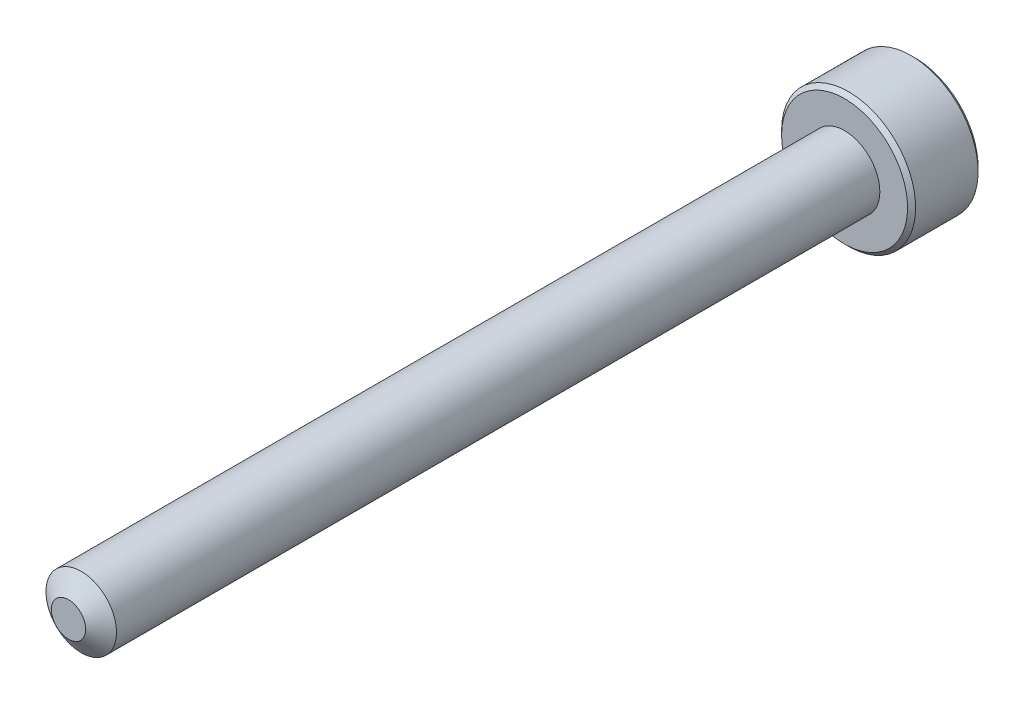
ISO-10303-21;
HEADER;
FILE_DESCRIPTION(('STEP AP214'),'2;1');
FILE_NAME('part.step','',(''),(''),'','','');
FILE_SCHEMA(('AUTOMOTIVE_DESIGN { 1 0 10303 214 1 1 1 1 }'));
ENDSEC;
DATA;
#1=APPLICATION_CONTEXT('core data for automotive mechanical design processes');
#2=APPLICATION_PROTOCOL_DEFINITION('international standard','automotive_design',2000,#1);
#3=PRODUCT_CONTEXT('',#1,'mechanical');
#4=PRODUCT('Part','Part','',(#3));
#5=PRODUCT_RELATED_PRODUCT_CATEGORY('part','',(#4));
#6=PRODUCT_DEFINITION_FORMATION('','',#4);
#7=PRODUCT_DEFINITION_CONTEXT('part definition',#1,'design');
#8=PRODUCT_DEFINITION('design','',#6,#7);
#9=PRODUCT_DEFINITION_SHAPE('','',#8);
#10=(LENGTH_UNIT() NAMED_UNIT(*) SI_UNIT(.MILLI.,.METRE.));
#11=(NAMED_UNIT(*) PLANE_ANGLE_UNIT() SI_UNIT($,.RADIAN.));
#12=(NAMED_UNIT(*) SI_UNIT($,.STERADIAN.) SOLID_ANGLE_UNIT());
#13=UNCERTAINTY_MEASURE_WITH_UNIT(LENGTH_MEASURE(1.E-05),#10,'distance_accuracy_value','');
#14=(GEOMETRIC_REPRESENTATION_CONTEXT(3) GLOBAL_UNCERTAINTY_ASSIGNED_CONTEXT((#13)) GLOBAL_UNIT_ASSIGNED_CONTEXT((#10,
#11,#12)) REPRESENTATION_CONTEXT('',''));
#15=CARTESIAN_POINT('',(0.,0.,0.));
#16=DIRECTION('',(0.,0.,1.));
#17=DIRECTION('',(1.,0.,0.));
#18=AXIS2_PLACEMENT_3D('',#15,#16,#17);
#19=CARTESIAN_POINT('',(0.,0.,-22.));
#20=DIRECTION('',(0.,0.,1.));
#21=DIRECTION('',(1.,0.,0.));
#22=AXIS2_PLACEMENT_3D('',#19,#20,#21);
#23=CYLINDRICAL_SURFACE('',#22,1.);
#24=CARTESIAN_POINT('',(0.,0.,-0.359771969508557));
#25=DIRECTION('',(0.,0.,1.));
#26=DIRECTION('',(1.,0.,0.));
#27=AXIS2_PLACEMENT_3D('',#24,#25,#26);
#28=CIRCLE('',#27,1.);
#29=CARTESIAN_POINT('',(1.,0.,-0.359771969508557));
#30=VERTEX_POINT('',#29);
#31=EDGE_CURVE('E109',#30,#30,#28,.T.);
#32=ORIENTED_EDGE('',*,*,#31,.F.);
#33=EDGE_LOOP('',(#32));
#34=FACE_BOUND('',#33,.T.);
#35=CARTESIAN_POINT('',(0.,0.,-22.));
#36=DIRECTION('',(0.,0.,-1.));
#37=DIRECTION('',(-1.,0.,0.));
#38=AXIS2_PLACEMENT_3D('',#35,#36,#37);
#39=CIRCLE('',#38,1.);
#40=CARTESIAN_POINT('',(-1.,0.,-22.));
#41=VERTEX_POINT('',#40);
#42=EDGE_CURVE('E212',#41,#41,#39,.F.);
#43=ORIENTED_EDGE('',*,*,#42,.T.);
#44=EDGE_LOOP('',(#43));
#45=FACE_BOUND('',#44,.T.);
#46=ADVANCED_FACE('F35',(#34,#45),#23,.T.);
#47=CARTESIAN_POINT('',(0.,0.,0.));
#48=DIRECTION('',(0.,0.,-1.));
#49=DIRECTION('',(-1.,0.,0.));
#50=AXIS2_PLACEMENT_3D('',#47,#48,#49);
#51=CONICAL_SURFACE('',#50,0.486192378864667,0.959931088596884);
#52=ORIENTED_EDGE('',*,*,#31,.T.);
#53=EDGE_LOOP('',(#52));
#54=FACE_BOUND('',#53,.T.);
#55=CARTESIAN_POINT('',(0.,0.,0.));
#56=DIRECTION('',(0.,0.,1.));
#57=DIRECTION('',(1.,0.,0.));
#58=AXIS2_PLACEMENT_3D('',#55,#56,#57);
#59=CIRCLE('',#58,0.486192378864667);
#60=CARTESIAN_POINT('',(0.486192378864667,0.,0.));
#61=VERTEX_POINT('',#60);
#62=EDGE_CURVE('E210',#61,#61,#59,.T.);
#63=ORIENTED_EDGE('',*,*,#62,.F.);
#64=EDGE_LOOP('',(#63));
#65=FACE_BOUND('',#64,.T.);
#66=ADVANCED_FACE('F193',(#54,#65),#51,.T.);
#67=CARTESIAN_POINT('',(0.,0.,0.));
#68=DIRECTION('',(0.,0.,1.));
#69=DIRECTION('',(1.,0.,0.));
#70=AXIS2_PLACEMENT_3D('',#67,#68,#69);
#71=PLANE('',#70);
#72=ORIENTED_EDGE('',*,*,#62,.T.);
#73=EDGE_LOOP('',(#72));
#74=FACE_BOUND('',#73,.T.);
#75=ADVANCED_FACE('F190',(#74),#71,.T.);
#76=CARTESIAN_POINT('',(0.,0.,-24.));
#77=DIRECTION('',(0.,0.,1.));
#78=DIRECTION('',(1.,0.,0.));
#79=AXIS2_PLACEMENT_3D('',#76,#77,#78);
#80=CYLINDRICAL_SURFACE('',#79,1.9);
#81=CARTESIAN_POINT('',(0.,0.,-23.886));
#82=DIRECTION('',(0.,0.,-1.));
#83=DIRECTION('',(-1.,0.,0.));
#84=AXIS2_PLACEMENT_3D('',#81,#82,#83);
#85=CIRCLE('',#84,1.9);
#86=CARTESIAN_POINT('',(-1.9,0.,-23.886));
#87=VERTEX_POINT('',#86);
#88=EDGE_CURVE('E43',#87,#87,#85,.F.);
#89=ORIENTED_EDGE('',*,*,#88,.T.);
#90=EDGE_LOOP('',(#89));
#91=FACE_BOUND('',#90,.T.);
#92=CARTESIAN_POINT('',(0.,0.,-22.114));
#93=DIRECTION('',(0.,0.,-1.));
#94=DIRECTION('',(-1.,0.,0.));
#95=AXIS2_PLACEMENT_3D('',#92,#93,#94);
#96=CIRCLE('',#95,1.9);
#97=CARTESIAN_POINT('',(-1.9,0.,-22.114));
#98=VERTEX_POINT('',#97);
#99=EDGE_CURVE('E169',#98,#98,#96,.T.);
#100=ORIENTED_EDGE('',*,*,#99,.T.);
#101=EDGE_LOOP('',(#100));
#102=FACE_BOUND('',#101,.T.);
#103=ADVANCED_FACE('F174',(#91,#102),#80,.T.);
#104=CARTESIAN_POINT('',(0.,0.,-24.));
#105=DIRECTION('',(0.,0.,-1.));
#106=DIRECTION('',(-1.,0.,0.));
#107=AXIS2_PLACEMENT_3D('',#104,#105,#106);
#108=PLANE('',#107);
#109=CARTESIAN_POINT('',(0.,0.,-24.));
#110=DIRECTION('',(0.,0.,-1.));
#111=DIRECTION('',(-1.,0.,0.));
#112=AXIS2_PLACEMENT_3D('',#109,#110,#111);
#113=CIRCLE('',#112,1.786);
#114=CARTESIAN_POINT('',(-1.786,0.,-24.));
#115=VERTEX_POINT('',#114);
#116=EDGE_CURVE('E108',#115,#115,#113,.T.);
#117=ORIENTED_EDGE('',*,*,#116,.T.);
#118=EDGE_LOOP('',(#117));
#119=FACE_BOUND('',#118,.T.);
#120=CARTESIAN_POINT('',(0.,0.,-24.));
#121=DIRECTION('',(0.,0.,-1.));
#122=DIRECTION('',(-1.,0.,0.));
#123=AXIS2_PLACEMENT_3D('',#120,#121,#122);
#124=CIRCLE('',#123,0.866025403784439);
#125=CARTESIAN_POINT('',(-0.75,0.433012701892219,-24.));
#126=VERTEX_POINT('',#125);
#127=CARTESIAN_POINT('',(0.,0.866025403784439,-24.));
#128=VERTEX_POINT('',#127);
#129=EDGE_CURVE('E89',#126,#128,#124,.T.);
#130=ORIENTED_EDGE('',*,*,#129,.F.);
#131=CARTESIAN_POINT('',(-0.75,-0.433012701892219,-24.));
#132=VERTEX_POINT('',#131);
#133=EDGE_CURVE('E49',#132,#126,#124,.T.);
#134=ORIENTED_EDGE('',*,*,#133,.F.);
#135=CARTESIAN_POINT('',(0.,-0.866025403784439,-24.));
#136=VERTEX_POINT('',#135);
#137=EDGE_CURVE('E269',#136,#132,#124,.T.);
#138=ORIENTED_EDGE('',*,*,#137,.F.);
#139=CARTESIAN_POINT('',(0.75,-0.433012701892219,-24.));
#140=VERTEX_POINT('',#139);
#141=EDGE_CURVE('E56',#140,#136,#124,.T.);
#142=ORIENTED_EDGE('',*,*,#141,.F.);
#143=CARTESIAN_POINT('',(0.75,0.43301270189222,-24.));
#144=VERTEX_POINT('',#143);
#145=EDGE_CURVE('E130',#144,#140,#124,.T.);
#146=ORIENTED_EDGE('',*,*,#145,.F.);
#147=EDGE_CURVE('E98',#128,#144,#124,.T.);
#148=ORIENTED_EDGE('',*,*,#147,.F.);
#149=EDGE_LOOP('',(#130,#134,#138,#142,#146,#148));
#150=FACE_BOUND('',#149,.T.);
#151=ADVANCED_FACE('F129',(#119,#150),#108,.T.);
#152=CARTESIAN_POINT('',(0.,0.,-22.));
#153=DIRECTION('',(0.,0.,-1.));
#154=DIRECTION('',(-1.,0.,0.));
#155=AXIS2_PLACEMENT_3D('',#152,#153,#154);
#156=PLANE('',#155);
#157=CARTESIAN_POINT('',(0.,0.,-22.));
#158=DIRECTION('',(0.,0.,-1.));
#159=DIRECTION('',(-1.,0.,0.));
#160=AXIS2_PLACEMENT_3D('',#157,#158,#159);
#161=CIRCLE('',#160,1.786);
#162=CARTESIAN_POINT('',(-1.786,0.,-22.));
#163=VERTEX_POINT('',#162);
#164=EDGE_CURVE('E11',#163,#163,#161,.F.);
#165=ORIENTED_EDGE('',*,*,#164,.T.);
#166=EDGE_LOOP('',(#165));
#167=FACE_BOUND('',#166,.T.);
#168=ORIENTED_EDGE('',*,*,#42,.F.);
#169=EDGE_LOOP('',(#168));
#170=FACE_BOUND('',#169,.T.);
#171=ADVANCED_FACE('F183',(#167,#170),#156,.F.);
#172=CARTESIAN_POINT('',(0.,0.,-24.));
#173=DIRECTION('',(0.,0.,-1.));
#174=DIRECTION('',(-1.,0.,0.));
#175=AXIS2_PLACEMENT_3D('',#172,#173,#174);
#176=CONICAL_SURFACE('',#175,0.866025403784439,0.78539816339745);
#177=ORIENTED_EDGE('',*,*,#147,.T.);
#178=CARTESIAN_POINT('',(-0.000200000000000044,0.866140873838277,-24.0001154931448));
#179=CARTESIAN_POINT('',(0.0255899625576817,0.851251032013209,-23.9852341104639));
#180=CARTESIAN_POINT('',(0.0518112021286595,0.836112192288419,-23.971226265607));
#181=CARTESIAN_POINT('',(0.105279708235706,0.805242135894348,-23.9455775246823));
#182=CARTESIAN_POINT('',(0.132532067460572,0.78950797895982,-23.9339509117057));
#183=CARTESIAN_POINT('',(0.187485350381352,0.757780686272653,-23.9140340457722));
#184=CARTESIAN_POINT('',(0.215172256695509,0.741795643459147,-23.9056936940814));
#185=CARTESIAN_POINT('',(0.271155595130853,0.709473647943368,-23.8928427419614));
#186=CARTESIAN_POINT('',(0.299450314843645,0.693137683900542,-23.8883225405888));
#187=CARTESIAN_POINT('',(0.348210289268843,0.664986099540475,-23.8842458330974));
#188=CARTESIAN_POINT('',(0.368612065655572,0.65320712845165,-23.8836427966141));
#189=CARTESIAN_POINT('',(0.40937613469636,0.629671982217687,-23.8846545060155));
#190=CARTESIAN_POINT('',(0.429738417651455,0.617915812672248,-23.88626974099));
#191=CARTESIAN_POINT('',(0.490534543086823,0.582815153286451,-23.894336146973));
#192=CARTESIAN_POINT('',(0.530665854996099,0.559645329552698,-23.9040089358277));
#193=CARTESIAN_POINT('',(0.601110400354026,0.518974152327358,-23.9273563179723));
#194=CARTESIAN_POINT('',(0.631753572009087,0.501282308923485,-23.9398085580723));
#195=CARTESIAN_POINT('',(0.69183934580479,0.466591771248069,-23.9678596102309));
#196=CARTESIAN_POINT('',(0.721285488381591,0.449591032904757,-23.9834481859038));
#197=CARTESIAN_POINT('',(0.7502,0.432897231838381,-24.0001154931448));
#198=B_SPLINE_CURVE_WITH_KNOTS('',3,(#178,#179,#180,#181,#182,#183,#184,#185,#186,#187,#188,
#189,#190,#191,#192,#193,#194,#195,#196,#197),.UNSPECIFIED.,.F.,.F.,(4,2,2,2,2,2,2,2,2,4),(0.,
0.0999419466095604,0.200466857654446,0.299393763705717,0.39807129730023,0.468665775681747,
0.539275821398839,0.680536257244566,0.792918418368075,0.904939568716032),.UNSPECIFIED.);
#199=EDGE_CURVE('E103',#128,#144,#198,.T.);
#200=ORIENTED_EDGE('',*,*,#199,.F.);
#201=EDGE_LOOP('',(#177,#200));
#202=FACE_BOUND('',#201,.T.);
#203=ADVANCED_FACE('F104',(#202),#176,.F.);
#204=ORIENTED_EDGE('',*,*,#145,.T.);
#205=CARTESIAN_POINT('',(0.75,-0.863604064848461,-24.2777892581354));
#206=CARTESIAN_POINT('',(0.75,-0.842575879734332,-24.2619149320084));
#207=CARTESIAN_POINT('',(0.75,-0.821430496291559,-24.246196265183));
#208=CARTESIAN_POINT('',(0.75,-0.778857857419019,-24.2151345206266));
#209=CARTESIAN_POINT('',(0.75,-0.757430533042236,-24.1997915374936));
#210=CARTESIAN_POINT('',(0.75,-0.692340710712936,-24.1542035802937));
#211=CARTESIAN_POINT('',(0.75,-0.648190081053413,-24.1246440917434));
#212=CARTESIAN_POINT('',(0.75,-0.55560718150175,-24.0666155826928));
#213=CARTESIAN_POINT('',(0.75,-0.507074363017996,-24.0383051093658));
#214=CARTESIAN_POINT('',(0.75,-0.407587529772338,-23.9865181117689));
#215=CARTESIAN_POINT('',(0.75,-0.356642419548471,-23.9630252915319));
#216=CARTESIAN_POINT('',(0.75,-0.280165468820771,-23.9342868995007));
#217=CARTESIAN_POINT('',(0.75,-0.255770023930572,-23.9260392748131));
#218=CARTESIAN_POINT('',(0.75,-0.206403277885132,-23.9114971754202));
#219=CARTESIAN_POINT('',(0.75,-0.181431937185907,-23.9052028352691));
#220=CARTESIAN_POINT('',(0.75,-0.106699879404924,-23.8899931738806));
#221=CARTESIAN_POINT('',(0.75,-0.0561907171762169,-23.8843771847129));
#222=CARTESIAN_POINT('',(0.75,0.0430767231749068,-23.8836282564544));
#223=CARTESIAN_POINT('',(0.75,0.0918322434166292,-23.8881234514056));
#224=CARTESIAN_POINT('',(0.75,0.164112195698296,-23.901337307446));
#225=CARTESIAN_POINT('',(0.75,0.188278676879438,-23.9069014463821));
#226=CARTESIAN_POINT('',(0.75,0.236094480120332,-23.9199231661487));
#227=CARTESIAN_POINT('',(0.75,0.259743845273042,-23.9273805885477));
#228=CARTESIAN_POINT('',(0.75,0.33419827846382,-23.9536664694661));
#229=CARTESIAN_POINT('',(0.75,0.383940060445496,-23.9754903380484));
#230=CARTESIAN_POINT('',(0.75,0.481089225076667,-24.0240118041006));
#231=CARTESIAN_POINT('',(0.75,0.528487417973018,-24.0507269113104));
#232=CARTESIAN_POINT('',(0.75,0.619071540465252,-24.1058428511508));
#233=CARTESIAN_POINT('',(0.75,0.662349745300239,-24.1340939454522));
#234=CARTESIAN_POINT('',(0.75,0.726111623216224,-24.1777671470975));
#235=CARTESIAN_POINT('',(0.75,0.747090419255278,-24.1924788605167));
#236=CARTESIAN_POINT('',(0.75,0.788761341501858,-24.2222913841024));
#237=CARTESIAN_POINT('',(0.75,0.809453544535618,-24.237392086763));
#238=CARTESIAN_POINT('',(0.75,0.830026390097468,-24.2526540893047));
#239=B_SPLINE_CURVE_WITH_KNOTS('',3,(#205,#206,#207,#208,#209,#210,#211,#212,#213,#214,#215,
#216,#217,#218,#219,#220,#221,#222,#223,#224,#225,#226,#227,#228,#229,#230,#231,#232,#233,#234,
#235,#236,#237,#238),.UNSPECIFIED.,.F.,.F.,(4,2,2,2,2,2,2,2,2,2,2,2,2,2,2,2,4),(0.,
0.0790398443124688,0.158099390497591,0.3174252086741,0.485845155681374,0.653685658303954,
0.730869805636062,0.808059268704007,0.959469653380778,1.10540290447489,1.17973203111653,
1.25405493988072,1.41653726506053,1.57961304287543,1.73458511695816,1.81145152932466,
1.8882969211581),.UNSPECIFIED.);
#240=EDGE_CURVE('E97',#144,#140,#239,.F.);
#241=ORIENTED_EDGE('',*,*,#240,.F.);
#242=EDGE_LOOP('',(#204,#241));
#243=FACE_BOUND('',#242,.T.);
#244=ADVANCED_FACE('F275',(#243),#176,.F.);
#245=ORIENTED_EDGE('',*,*,#141,.T.);
#246=CARTESIAN_POINT('',(0.7502,-0.432897231838381,-24.0001154931448));
#247=CARTESIAN_POINT('',(0.724410037442318,-0.447787073663449,-23.9852341104639));
#248=CARTESIAN_POINT('',(0.69818879787134,-0.462925913388239,-23.971226265607));
#249=CARTESIAN_POINT('',(0.644720291764294,-0.49379596978231,-23.9455775246823));
#250=CARTESIAN_POINT('',(0.617467932539428,-0.509530126716839,-23.9339509117057));
#251=CARTESIAN_POINT('',(0.562514649618648,-0.541257419404005,-23.9140340457722));
#252=CARTESIAN_POINT('',(0.534827743304491,-0.557242462217511,-23.9056936940814));
#253=CARTESIAN_POINT('',(0.478844404869147,-0.58956445773329,-23.8928427419614));
#254=CARTESIAN_POINT('',(0.450549685156355,-0.605900421776116,-23.8883225405888));
#255=CARTESIAN_POINT('',(0.401789710731157,-0.634052006136183,-23.8842458330974));
#256=CARTESIAN_POINT('',(0.381387934344428,-0.645830977225008,-23.8836427966141));
#257=CARTESIAN_POINT('',(0.34062386530364,-0.669366123458971,-23.8846545060155));
#258=CARTESIAN_POINT('',(0.320261582348545,-0.681122293004411,-23.88626974099));
#259=CARTESIAN_POINT('',(0.259465456913177,-0.716222952390207,-23.894336146973));
#260=CARTESIAN_POINT('',(0.219334145003901,-0.73939277612396,-23.9040089358277));
#261=CARTESIAN_POINT('',(0.148889599645975,-0.7800639533493,-23.9273563179723));
#262=CARTESIAN_POINT('',(0.118246427990914,-0.797755796753173,-23.9398085580723));
#263=CARTESIAN_POINT('',(0.0581606541952106,-0.832446334428589,-23.9678596102309));
#264=CARTESIAN_POINT('',(0.0287145116184095,-0.849447072771901,-23.9834481859038));
#265=CARTESIAN_POINT('',(-0.000200000000000335,-0.866140873838277,-24.0001154931448));
#266=B_SPLINE_CURVE_WITH_KNOTS('',3,(#246,#247,#248,#249,#250,#251,#252,#253,#254,#255,#256,
#257,#258,#259,#260,#261,#262,#263,#264,#265),.UNSPECIFIED.,.F.,.F.,(4,2,2,2,2,2,2,2,2,4),(0.,
0.0999419466095605,0.200466857654446,0.299393763705717,0.39807129730023,0.468665775681747,
0.539275821398839,0.680536257244566,0.792918418368074,0.904939568716033),.UNSPECIFIED.);
#267=EDGE_CURVE('E139',#140,#136,#266,.T.);
#268=ORIENTED_EDGE('',*,*,#267,.F.);
#269=EDGE_LOOP('',(#245,#268));
#270=FACE_BOUND('',#269,.T.);
#271=ADVANCED_FACE('F272',(#270),#176,.F.);
#272=ORIENTED_EDGE('',*,*,#137,.T.);
#273=CARTESIAN_POINT('',(0.000199999999999965,-0.866140873838277,-24.0001154931448));
#274=CARTESIAN_POINT('',(-0.0255899625576817,-0.851251032013209,-23.9852341104639));
#275=CARTESIAN_POINT('',(-0.0518112021286595,-0.836112192288419,-23.971226265607));
#276=CARTESIAN_POINT('',(-0.105279708235706,-0.805242135894348,-23.9455775246823));
#277=CARTESIAN_POINT('',(-0.132532067460572,-0.78950797895982,-23.9339509117057));
#278=CARTESIAN_POINT('',(-0.187485350381353,-0.757780686272654,-23.9140340457722));
#279=CARTESIAN_POINT('',(-0.215172256695509,-0.741795643459147,-23.9056936940814));
#280=CARTESIAN_POINT('',(-0.271155595130853,-0.709473647943368,-23.8928427419614));
#281=CARTESIAN_POINT('',(-0.299450314843645,-0.693137683900542,-23.8883225405888));
#282=CARTESIAN_POINT('',(-0.348210289268843,-0.664986099540475,-23.8842458330974));
#283=CARTESIAN_POINT('',(-0.368612065655572,-0.65320712845165,-23.8836427966141));
#284=CARTESIAN_POINT('',(-0.40937613469636,-0.629671982217687,-23.8846545060155));
#285=CARTESIAN_POINT('',(-0.429738417651455,-0.617915812672248,-23.88626974099));
#286=CARTESIAN_POINT('',(-0.490534543086824,-0.582815153286451,-23.894336146973));
#287=CARTESIAN_POINT('',(-0.530665854996099,-0.559645329552698,-23.9040089358277));
#288=CARTESIAN_POINT('',(-0.601110400354026,-0.518974152327358,-23.9273563179723));
#289=CARTESIAN_POINT('',(-0.631753572009086,-0.501282308923485,-23.9398085580723));
#290=CARTESIAN_POINT('',(-0.691839345804789,-0.466591771248069,-23.9678596102309));
#291=CARTESIAN_POINT('',(-0.721285488381591,-0.449591032904757,-23.9834481859038));
#292=CARTESIAN_POINT('',(-0.7502,-0.432897231838382,-24.0001154931448));
#293=B_SPLINE_CURVE_WITH_KNOTS('',3,(#273,#274,#275,#276,#277,#278,#279,#280,#281,#282,#283,
#284,#285,#286,#287,#288,#289,#290,#291,#292),.UNSPECIFIED.,.F.,.F.,(4,2,2,2,2,2,2,2,2,4),(0.,
0.0999419466095604,0.200466857654446,0.299393763705717,0.39807129730023,0.468665775681748,
0.539275821398839,0.680536257244566,0.792918418368073,0.904939568716032),.UNSPECIFIED.);
#294=EDGE_CURVE('E247',#136,#132,#293,.T.);
#295=ORIENTED_EDGE('',*,*,#294,.F.);
#296=EDGE_LOOP('',(#272,#295));
#297=FACE_BOUND('',#296,.T.);
#298=ADVANCED_FACE('F271',(#297),#176,.F.);
#299=ORIENTED_EDGE('',*,*,#133,.T.);
#300=CARTESIAN_POINT('',(-0.75,-0.863604064974113,-24.2777892582303));
#301=CARTESIAN_POINT('',(-0.75,-0.842575879856459,-24.2619149320996));
#302=CARTESIAN_POINT('',(-0.75,-0.821430496410149,-24.2461962652706));
#303=CARTESIAN_POINT('',(-0.75,-0.778857857530498,-24.2151345207069));
#304=CARTESIAN_POINT('',(-0.75,-0.757430533150143,-24.1997915375702));
#305=CARTESIAN_POINT('',(-0.75,-0.692340710809909,-24.1542035803594));
#306=CARTESIAN_POINT('',(-0.75,-0.648190081142953,-24.1246440918019));
#307=CARTESIAN_POINT('',(-0.75,-0.555607181575075,-24.0666155827363));
#308=CARTESIAN_POINT('',(-0.75,-0.507074363082498,-24.0383051094017));
#309=CARTESIAN_POINT('',(-0.75,-0.407587529818442,-23.9865181117906));
#310=CARTESIAN_POINT('',(-0.75,-0.356642419585009,-23.9630252915471));
#311=CARTESIAN_POINT('',(-0.75,-0.280165468850112,-23.934286899511));
#312=CARTESIAN_POINT('',(-0.75,-0.255770023962928,-23.9260392748236));
#313=CARTESIAN_POINT('',(-0.75,-0.206403277923611,-23.9114971754305));
#314=CARTESIAN_POINT('',(-0.75,-0.181431937227495,-23.905202835279));
#315=CARTESIAN_POINT('',(-0.75,-0.106699879455628,-23.8899931738882));
#316=CARTESIAN_POINT('',(-0.75,-0.0561907172329761,-23.8843771847175));
#317=CARTESIAN_POINT('',(-0.75,0.0430767231074209,-23.8836282564508));
#318=CARTESIAN_POINT('',(-0.75,0.0918322433444392,-23.888123451397));
#319=CARTESIAN_POINT('',(-0.75,0.164112195619628,-23.9013373074292));
#320=CARTESIAN_POINT('',(-0.75,0.18827867679862,-23.9069014463624));
#321=CARTESIAN_POINT('',(-0.75,0.236094480035416,-23.9199231661233));
#322=CARTESIAN_POINT('',(-0.75,0.259743845186179,-23.9273805885192));
#323=CARTESIAN_POINT('',(-0.75,0.33419827835804,-23.9536664694238));
#324=CARTESIAN_POINT('',(-0.75,0.383940060323698,-23.9754903379934));
#325=CARTESIAN_POINT('',(-0.75,0.48108922492406,-24.0240118040186));
#326=CARTESIAN_POINT('',(-0.75,0.528487417805627,-24.0507269112142));
#327=CARTESIAN_POINT('',(-0.75,0.619071540271285,-24.1058428510274));
#328=CARTESIAN_POINT('',(-0.75,0.662349745094384,-24.134093945316));
#329=CARTESIAN_POINT('',(-0.75,0.726111622992789,-24.1777671469421));
#330=CARTESIAN_POINT('',(-0.75,0.747090419026068,-24.1924788603549));
#331=CARTESIAN_POINT('',(-0.75,0.788761341261133,-24.222291383928));
#332=CARTESIAN_POINT('',(-0.75,0.809453544289155,-24.2373920865822));
#333=CARTESIAN_POINT('',(-0.75,0.830026389845277,-24.2526540891176));
#334=B_SPLINE_CURVE_WITH_KNOTS('',3,(#300,#301,#302,#303,#304,#305,#306,#307,#308,#309,#310,
#311,#312,#313,#314,#315,#316,#317,#318,#319,#320,#321,#322,#323,#324,#325,#326,#327,#328,#329,
#330,#331,#332,#333),.UNSPECIFIED.,.F.,.F.,(4,2,2,2,2,2,2,2,2,2,2,2,2,2,2,2,4),(0.,
0.0790398443275137,0.158099390527688,0.317425208734854,0.485845155776514,0.653685658433148,
0.73086980575654,0.808059268815783,0.959469653475937,1.1054029045548,1.17973203118821,
1.25405493994416,1.41653726506484,1.5796130428202,1.73458511685199,1.81145152919337,
1.88829692100169),.UNSPECIFIED.);
#335=EDGE_CURVE('E119',#132,#126,#334,.T.);
#336=ORIENTED_EDGE('',*,*,#335,.F.);
#337=EDGE_LOOP('',(#299,#336));
#338=FACE_BOUND('',#337,.T.);
#339=ADVANCED_FACE('F284',(#338),#176,.F.);
#340=ORIENTED_EDGE('',*,*,#129,.T.);
#341=CARTESIAN_POINT('',(-0.7502,0.432897231838382,-24.0001154931448));
#342=CARTESIAN_POINT('',(-0.724410037442318,0.447787073663449,-23.9852341104639));
#343=CARTESIAN_POINT('',(-0.698188797871341,0.462925913388239,-23.971226265607));
#344=CARTESIAN_POINT('',(-0.644720291764294,0.49379596978231,-23.9455775246823));
#345=CARTESIAN_POINT('',(-0.617467932539428,0.509530126716839,-23.9339509117057));
#346=CARTESIAN_POINT('',(-0.562514649618647,0.541257419404005,-23.9140340457722));
#347=CARTESIAN_POINT('',(-0.53482774330449,0.557242462217511,-23.9056936940814));
#348=CARTESIAN_POINT('',(-0.478844404869146,0.589564457733291,-23.8928427419614));
#349=CARTESIAN_POINT('',(-0.450549685156355,0.605900421776116,-23.8883225405888));
#350=CARTESIAN_POINT('',(-0.401789710731157,0.634052006136183,-23.8842458330974));
#351=CARTESIAN_POINT('',(-0.381387934344428,0.645830977225008,-23.8836427966141));
#352=CARTESIAN_POINT('',(-0.34062386530364,0.669366123458971,-23.8846545060155));
#353=CARTESIAN_POINT('',(-0.320261582348545,0.681122293004411,-23.88626974099));
#354=CARTESIAN_POINT('',(-0.259465456913176,0.716222952390207,-23.894336146973));
#355=CARTESIAN_POINT('',(-0.219334145003901,0.73939277612396,-23.9040089358277));
#356=CARTESIAN_POINT('',(-0.148889599645975,0.7800639533493,-23.9273563179723));
#357=CARTESIAN_POINT('',(-0.118246427990914,0.797755796753173,-23.9398085580723));
#358=CARTESIAN_POINT('',(-0.0581606541952105,0.832446334428589,-23.9678596102309));
#359=CARTESIAN_POINT('',(-0.0287145116184094,0.849447072771901,-23.9834481859038));
#360=CARTESIAN_POINT('',(0.000200000000000324,0.866140873838277,-24.0001154931448));
#361=B_SPLINE_CURVE_WITH_KNOTS('',3,(#341,#342,#343,#344,#345,#346,#347,#348,#349,#350,#351,
#352,#353,#354,#355,#356,#357,#358,#359,#360),.UNSPECIFIED.,.F.,.F.,(4,2,2,2,2,2,2,2,2,4),(0.,
0.0999419466095604,0.200466857654446,0.299393763705718,0.39807129730023,0.468665775681748,
0.539275821398839,0.680536257244566,0.792918418368074,0.904939568716032),.UNSPECIFIED.);
#362=EDGE_CURVE('E93',#126,#128,#361,.T.);
#363=ORIENTED_EDGE('',*,*,#362,.F.);
#364=EDGE_LOOP('',(#340,#363));
#365=FACE_BOUND('',#364,.T.);
#366=ADVANCED_FACE('F91',(#365),#176,.F.);
#367=CARTESIAN_POINT('',(0.75,1.29903810567666,-22.875));
#368=DIRECTION('',(0.,0.,-1.));
#369=DIRECTION('',(-1.,0.,0.));
#370=AXIS2_PLACEMENT_3D('',#367,#368,#369);
#371=PLANE('',#370);
#372=DIRECTION('',(0.866025403784439,0.5,0.));
#373=VECTOR('',#372,1.);
#374=CARTESIAN_POINT('',(-0.75,0.43301270189222,-22.875));
#375=LINE('',#374,#373);
#376=CARTESIAN_POINT('',(-0.75,0.43301270189222,-22.875));
#377=VERTEX_POINT('',#376);
#378=CARTESIAN_POINT('',(0.,0.866025403784439,-22.875));
#379=VERTEX_POINT('',#378);
#380=EDGE_CURVE('E118',#377,#379,#375,.T.);
#381=ORIENTED_EDGE('',*,*,#380,.T.);
#382=DIRECTION('',(0.866025403784439,-0.5,0.));
#383=VECTOR('',#382,1.);
#384=CARTESIAN_POINT('',(0.,0.866025403784439,-22.875));
#385=LINE('',#384,#383);
#386=CARTESIAN_POINT('',(0.75,0.433012701892219,-22.875));
#387=VERTEX_POINT('',#386);
#388=EDGE_CURVE('E123',#379,#387,#385,.T.);
#389=ORIENTED_EDGE('',*,*,#388,.T.);
#390=DIRECTION('',(0.,-1.,0.));
#391=VECTOR('',#390,1.);
#392=CARTESIAN_POINT('',(0.75,0.433012701892219,-22.875));
#393=LINE('',#392,#391);
#394=CARTESIAN_POINT('',(0.75,-0.433012701892219,-22.875));
#395=VERTEX_POINT('',#394);
#396=EDGE_CURVE('E235',#387,#395,#393,.T.);
#397=ORIENTED_EDGE('',*,*,#396,.T.);
#398=DIRECTION('',(-0.866025403784439,-0.5,0.));
#399=VECTOR('',#398,1.);
#400=CARTESIAN_POINT('',(0.75,-0.433012701892219,-22.875));
#401=LINE('',#400,#399);
#402=CARTESIAN_POINT('',(0.,-0.866025403784439,-22.875));
#403=VERTEX_POINT('',#402);
#404=EDGE_CURVE('E232',#395,#403,#401,.T.);
#405=ORIENTED_EDGE('',*,*,#404,.T.);
#406=DIRECTION('',(-0.866025403784439,0.5,0.));
#407=VECTOR('',#406,1.);
#408=CARTESIAN_POINT('',(0.,-0.866025403784439,-22.875));
#409=LINE('',#408,#407);
#410=CARTESIAN_POINT('',(-0.75,-0.433012701892219,-22.875));
#411=VERTEX_POINT('',#410);
#412=EDGE_CURVE('E229',#403,#411,#409,.T.);
#413=ORIENTED_EDGE('',*,*,#412,.T.);
#414=DIRECTION('',(0.,1.,0.));
#415=VECTOR('',#414,1.);
#416=CARTESIAN_POINT('',(-0.75,-0.433012701892219,-22.875));
#417=LINE('',#416,#415);
#418=EDGE_CURVE('E126',#411,#377,#417,.T.);
#419=ORIENTED_EDGE('',*,*,#418,.T.);
#420=EDGE_LOOP('',(#381,#389,#397,#405,#413,#419));
#421=FACE_BOUND('',#420,.T.);
#422=ADVANCED_FACE('F158',(#421),#371,.T.);
#423=CARTESIAN_POINT('',(0.,0.866025403784439,-22.875));
#424=DIRECTION('',(0.5,0.866025403784439,0.));
#425=DIRECTION('',(-0.866025403784439,0.5,0.));
#426=AXIS2_PLACEMENT_3D('',#423,#424,#425);
#427=PLANE('',#426);
#428=DIRECTION('',(0.,0.,-1.));
#429=VECTOR('',#428,1.);
#430=CARTESIAN_POINT('',(0.,0.866025403784439,-22.875));
#431=LINE('',#430,#429);
#432=EDGE_CURVE('E115',#379,#128,#431,.T.);
#433=ORIENTED_EDGE('',*,*,#432,.T.);
#434=ORIENTED_EDGE('',*,*,#199,.T.);
#435=DIRECTION('',(0.,0.,-1.));
#436=VECTOR('',#435,1.);
#437=CARTESIAN_POINT('',(0.75,0.433012701892219,-22.875));
#438=LINE('',#437,#436);
#439=EDGE_CURVE('E125',#387,#144,#438,.T.);
#440=ORIENTED_EDGE('',*,*,#439,.F.);
#441=ORIENTED_EDGE('',*,*,#388,.F.);
#442=EDGE_LOOP('',(#433,#434,#440,#441));
#443=FACE_BOUND('',#442,.T.);
#444=ADVANCED_FACE('F121',(#443),#427,.F.);
#445=CARTESIAN_POINT('',(0.75,0.433012701892219,-22.875));
#446=DIRECTION('',(1.,0.,0.));
#447=DIRECTION('',(0.,0.,-1.));
#448=AXIS2_PLACEMENT_3D('',#445,#446,#447);
#449=PLANE('',#448);
#450=ORIENTED_EDGE('',*,*,#439,.T.);
#451=ORIENTED_EDGE('',*,*,#240,.T.);
#452=DIRECTION('',(0.,0.,-1.));
#453=VECTOR('',#452,1.);
#454=CARTESIAN_POINT('',(0.75,-0.433012701892219,-22.875));
#455=LINE('',#454,#453);
#456=EDGE_CURVE('E218',#395,#140,#455,.T.);
#457=ORIENTED_EDGE('',*,*,#456,.F.);
#458=ORIENTED_EDGE('',*,*,#396,.F.);
#459=EDGE_LOOP('',(#450,#451,#457,#458));
#460=FACE_BOUND('',#459,.T.);
#461=ADVANCED_FACE('F147',(#460),#449,.F.);
#462=CARTESIAN_POINT('',(0.75,-0.433012701892219,-22.875));
#463=DIRECTION('',(0.5,-0.866025403784439,0.));
#464=DIRECTION('',(0.866025403784439,0.5,0.));
#465=AXIS2_PLACEMENT_3D('',#462,#463,#464);
#466=PLANE('',#465);
#467=ORIENTED_EDGE('',*,*,#456,.T.);
#468=ORIENTED_EDGE('',*,*,#267,.T.);
#469=DIRECTION('',(0.,0.,-1.));
#470=VECTOR('',#469,1.);
#471=CARTESIAN_POINT('',(0.,-0.866025403784439,-22.875));
#472=LINE('',#471,#470);
#473=EDGE_CURVE('E221',#403,#136,#472,.T.);
#474=ORIENTED_EDGE('',*,*,#473,.F.);
#475=ORIENTED_EDGE('',*,*,#404,.F.);
#476=EDGE_LOOP('',(#467,#468,#474,#475));
#477=FACE_BOUND('',#476,.T.);
#478=ADVANCED_FACE('F151',(#477),#466,.F.);
#479=CARTESIAN_POINT('',(0.,-0.866025403784439,-22.875));
#480=DIRECTION('',(-0.5,-0.866025403784439,0.));
#481=DIRECTION('',(0.866025403784439,-0.5,0.));
#482=AXIS2_PLACEMENT_3D('',#479,#480,#481);
#483=PLANE('',#482);
#484=ORIENTED_EDGE('',*,*,#473,.T.);
#485=ORIENTED_EDGE('',*,*,#294,.T.);
#486=DIRECTION('',(0.,0.,-1.));
#487=VECTOR('',#486,1.);
#488=CARTESIAN_POINT('',(-0.75,-0.433012701892219,-22.875));
#489=LINE('',#488,#487);
#490=EDGE_CURVE('E224',#411,#132,#489,.T.);
#491=ORIENTED_EDGE('',*,*,#490,.F.);
#492=ORIENTED_EDGE('',*,*,#412,.F.);
#493=EDGE_LOOP('',(#484,#485,#491,#492));
#494=FACE_BOUND('',#493,.T.);
#495=ADVANCED_FACE('F254',(#494),#483,.F.);
#496=CARTESIAN_POINT('',(-0.75,-0.433012701892219,-22.875));
#497=DIRECTION('',(-1.,0.,0.));
#498=DIRECTION('',(0.,-1.,0.));
#499=AXIS2_PLACEMENT_3D('',#496,#497,#498);
#500=PLANE('',#499);
#501=ORIENTED_EDGE('',*,*,#490,.T.);
#502=ORIENTED_EDGE('',*,*,#335,.T.);
#503=DIRECTION('',(0.,0.,-1.));
#504=VECTOR('',#503,1.);
#505=CARTESIAN_POINT('',(-0.75,0.43301270189222,-22.875));
#506=LINE('',#505,#504);
#507=EDGE_CURVE('E117',#377,#126,#506,.T.);
#508=ORIENTED_EDGE('',*,*,#507,.F.);
#509=ORIENTED_EDGE('',*,*,#418,.F.);
#510=EDGE_LOOP('',(#501,#502,#508,#509));
#511=FACE_BOUND('',#510,.T.);
#512=ADVANCED_FACE('F251',(#511),#500,.F.);
#513=CARTESIAN_POINT('',(-0.75,0.43301270189222,-22.875));
#514=DIRECTION('',(-0.5,0.866025403784439,0.));
#515=DIRECTION('',(-0.866025403784439,-0.5,0.));
#516=AXIS2_PLACEMENT_3D('',#513,#514,#515);
#517=PLANE('',#516);
#518=ORIENTED_EDGE('',*,*,#507,.T.);
#519=ORIENTED_EDGE('',*,*,#362,.T.);
#520=ORIENTED_EDGE('',*,*,#432,.F.);
#521=ORIENTED_EDGE('',*,*,#380,.F.);
#522=EDGE_LOOP('',(#518,#519,#520,#521));
#523=FACE_BOUND('',#522,.T.);
#524=ADVANCED_FACE('F113',(#523),#517,.F.);
#525=CARTESIAN_POINT('',(0.,0.,-24.));
#526=DIRECTION('',(0.,0.,1.));
#527=DIRECTION('',(1.,0.,0.));
#528=AXIS2_PLACEMENT_3D('',#525,#526,#527);
#529=CONICAL_SURFACE('',#528,1.786,0.785398163397453);
#530=ORIENTED_EDGE('',*,*,#88,.F.);
#531=EDGE_LOOP('',(#530));
#532=FACE_BOUND('',#531,.T.);
#533=ORIENTED_EDGE('',*,*,#116,.F.);
#534=EDGE_LOOP('',(#533));
#535=FACE_BOUND('',#534,.T.);
#536=ADVANCED_FACE('F177',(#532,#535),#529,.T.);
#537=CARTESIAN_POINT('',(0.,0.,-22.114));
#538=DIRECTION('',(0.,0.,-1.));
#539=DIRECTION('',(-1.,0.,0.));
#540=AXIS2_PLACEMENT_3D('',#537,#538,#539);
#541=CONICAL_SURFACE('',#540,1.9,0.785398163397453);
#542=ORIENTED_EDGE('',*,*,#164,.F.);
#543=EDGE_LOOP('',(#542));
#544=FACE_BOUND('',#543,.T.);
#545=ORIENTED_EDGE('',*,*,#99,.F.);
#546=EDGE_LOOP('',(#545));
#547=FACE_BOUND('',#546,.T.);
#548=ADVANCED_FACE('F37',(#544,#547),#541,.T.);
#549=CLOSED_SHELL('',(#46,#66,#75,#103,#151,#171,#203,#244,#271,#298,#339,#366,#422,#444,#461,
#478,#495,#512,#524,#536,#548));
#550=MANIFOLD_SOLID_BREP('B2',#549);
#551=ADVANCED_BREP_SHAPE_REPRESENTATION('',(#18,#550),#14);
#552=SHAPE_DEFINITION_REPRESENTATION(#9,#551);
ENDSEC;
END-ISO-10303-21;
